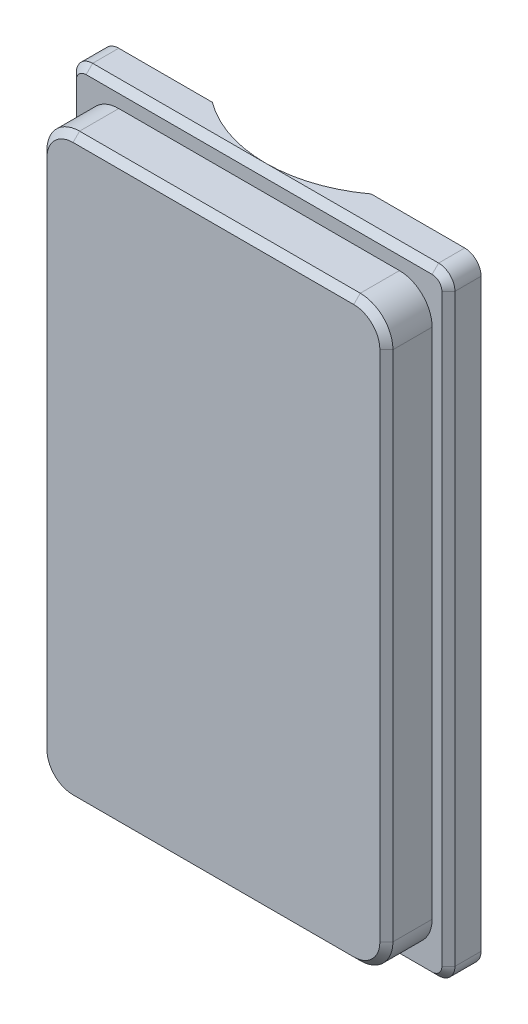
ISO-10303-21;
HEADER;
FILE_DESCRIPTION(('STEP AP214'),'2;1');
FILE_NAME('part.step','',(''),(''),'','','');
FILE_SCHEMA(('AUTOMOTIVE_DESIGN { 1 0 10303 214 1 1 1 1 }'));
ENDSEC;
DATA;
#1=APPLICATION_CONTEXT('core data for automotive mechanical design processes');
#2=APPLICATION_PROTOCOL_DEFINITION('international standard','automotive_design',2000,#1);
#3=PRODUCT_CONTEXT('',#1,'mechanical');
#4=PRODUCT('Part','Part','',(#3));
#5=PRODUCT_RELATED_PRODUCT_CATEGORY('part','',(#4));
#6=PRODUCT_DEFINITION_FORMATION('','',#4);
#7=PRODUCT_DEFINITION_CONTEXT('part definition',#1,'design');
#8=PRODUCT_DEFINITION('design','',#6,#7);
#9=PRODUCT_DEFINITION_SHAPE('','',#8);
#10=(LENGTH_UNIT() NAMED_UNIT(*) SI_UNIT(.MILLI.,.METRE.));
#11=(NAMED_UNIT(*) PLANE_ANGLE_UNIT() SI_UNIT($,.RADIAN.));
#12=(NAMED_UNIT(*) SI_UNIT($,.STERADIAN.) SOLID_ANGLE_UNIT());
#13=UNCERTAINTY_MEASURE_WITH_UNIT(LENGTH_MEASURE(1.E-05),#10,'distance_accuracy_value','');
#14=(GEOMETRIC_REPRESENTATION_CONTEXT(3) GLOBAL_UNCERTAINTY_ASSIGNED_CONTEXT((#13)) GLOBAL_UNIT_ASSIGNED_CONTEXT((#10,
#11,#12)) REPRESENTATION_CONTEXT('',''));
#15=CARTESIAN_POINT('',(0.,0.,0.));
#16=DIRECTION('',(0.,0.,1.));
#17=DIRECTION('',(1.,0.,0.));
#18=AXIS2_PLACEMENT_3D('',#15,#16,#17);
#19=CARTESIAN_POINT('',(5.3,-78.9729999997179,0.));
#20=DIRECTION('',(0.,0.,1.));
#21=DIRECTION('',(1.,0.,0.));
#22=AXIS2_PLACEMENT_3D('',#19,#20,#21);
#23=PLANE('',#22);
#24=DIRECTION('',(-1.,0.,0.));
#25=VECTOR('',#24,1.);
#26=CARTESIAN_POINT('',(5.3,-60.5629999997179,0.));
#27=LINE('',#26,#25);
#28=CARTESIAN_POINT('',(-2.43310501226972,-60.5629999997179,0.));
#29=VERTEX_POINT('',#28);
#30=CARTESIAN_POINT('',(-5.30000000000002,-60.5629999997179,0.));
#31=VERTEX_POINT('',#30);
#32=EDGE_CURVE('E240',#29,#31,#27,.T.);
#33=ORIENTED_EDGE('',*,*,#32,.F.);
#34=DIRECTION('',(0.,-1.,0.));
#35=VECTOR('',#34,1.);
#36=CARTESIAN_POINT('',(-2.43310501226972,-60.5629999997179,0.));
#37=LINE('',#36,#35);
#38=CARTESIAN_POINT('',(-2.43310501226972,-79.4729999997179,0.));
#39=VERTEX_POINT('',#38);
#40=EDGE_CURVE('E234',#29,#39,#37,.T.);
#41=ORIENTED_EDGE('',*,*,#40,.T.);
#42=DIRECTION('',(1.,0.,0.));
#43=VECTOR('',#42,1.);
#44=CARTESIAN_POINT('',(5.3,-79.4729999997179,0.));
#45=LINE('',#44,#43);
#46=CARTESIAN_POINT('',(-5.30000000000002,-79.4729999997179,0.));
#47=VERTEX_POINT('',#46);
#48=EDGE_CURVE('E242',#47,#39,#45,.T.);
#49=ORIENTED_EDGE('',*,*,#48,.F.);
#50=CARTESIAN_POINT('',(-5.30000000000002,-78.9729999997179,0.));
#51=DIRECTION('',(0.,0.,-1.));
#52=DIRECTION('',(-1.,0.,0.));
#53=AXIS2_PLACEMENT_3D('',#50,#51,#52);
#54=CIRCLE('',#53,0.500000000000001);
#55=CARTESIAN_POINT('',(-5.80000000000002,-78.9729999997179,0.));
#56=VERTEX_POINT('',#55);
#57=EDGE_CURVE('E483',#47,#56,#54,.T.);
#58=ORIENTED_EDGE('',*,*,#57,.T.);
#59=DIRECTION('',(0.,1.,0.));
#60=VECTOR('',#59,1.);
#61=CARTESIAN_POINT('',(-5.80000000000001,-61.0629999997179,0.));
#62=LINE('',#61,#60);
#63=CARTESIAN_POINT('',(-5.80000000000001,-61.0629999997179,0.));
#64=VERTEX_POINT('',#63);
#65=EDGE_CURVE('E491',#56,#64,#62,.T.);
#66=ORIENTED_EDGE('',*,*,#65,.T.);
#67=CARTESIAN_POINT('',(-5.30000000000002,-61.0629999997179,0.));
#68=DIRECTION('',(0.,0.,-1.));
#69=DIRECTION('',(-1.,0.,0.));
#70=AXIS2_PLACEMENT_3D('',#67,#68,#69);
#71=CIRCLE('',#70,0.5);
#72=EDGE_CURVE('E485',#64,#31,#71,.T.);
#73=ORIENTED_EDGE('',*,*,#72,.T.);
#74=EDGE_LOOP('',(#33,#41,#49,#58,#66,#73));
#75=FACE_BOUND('',#74,.T.);
#76=ADVANCED_FACE('F37',(#75),#23,.F.);
#77=CARTESIAN_POINT('',(5.3,-60.5629999997179,1.));
#78=DIRECTION('',(0.,-1.,0.));
#79=DIRECTION('',(0.,0.,-1.));
#80=AXIS2_PLACEMENT_3D('',#77,#78,#79);
#81=PLANE('',#80);
#82=CARTESIAN_POINT('',(5.3,-60.5629999997179,0.));
#83=VERTEX_POINT('',#82);
#84=CARTESIAN_POINT('',(2.43310501196556,-60.5629999997179,0.));
#85=VERTEX_POINT('',#84);
#86=EDGE_CURVE('E231',#83,#85,#27,.T.);
#87=ORIENTED_EDGE('',*,*,#86,.T.);
#88=CARTESIAN_POINT('',(-1.52082346450913E-10,-60.5629999997179,-3.29999999999499));
#89=DIRECTION('',(0.,-1.,0.));
#90=DIRECTION('',(0.,0.,-1.));
#91=AXIS2_PLACEMENT_3D('',#88,#89,#90);
#92=CIRCLE('',#91,4.09999999999499);
#93=CARTESIAN_POINT('',(-1.52082346450913E-10,-60.5629999997179,0.800000000000001));
#94=VERTEX_POINT('',#93);
#95=EDGE_CURVE('E216',#85,#94,#92,.T.);
#96=ORIENTED_EDGE('',*,*,#95,.T.);
#97=DIRECTION('',(1.,0.,0.));
#98=VECTOR('',#97,1.);
#99=CARTESIAN_POINT('',(5.3,-60.5629999997179,0.800000000000001));
#100=LINE('',#99,#98);
#101=CARTESIAN_POINT('',(5.3,-60.5629999997179,0.800000000000001));
#102=VERTEX_POINT('',#101);
#103=EDGE_CURVE('E298',#94,#102,#100,.T.);
#104=ORIENTED_EDGE('',*,*,#103,.T.);
#105=DIRECTION('',(0.,0.,-1.));
#106=VECTOR('',#105,1.);
#107=CARTESIAN_POINT('',(5.3,-60.5629999997179,1.));
#108=LINE('',#107,#106);
#109=EDGE_CURVE('E238',#102,#83,#108,.T.);
#110=ORIENTED_EDGE('',*,*,#109,.T.);
#111=EDGE_LOOP('',(#87,#96,#104,#110));
#112=FACE_BOUND('',#111,.T.);
#113=ADVANCED_FACE('F236',(#112),#81,.F.);
#114=CARTESIAN_POINT('',(5.3,-79.4729999997179,1.));
#115=DIRECTION('',(0.,1.,0.));
#116=DIRECTION('',(0.,0.,1.));
#117=AXIS2_PLACEMENT_3D('',#114,#115,#116);
#118=PLANE('',#117);
#119=DIRECTION('',(-1.,0.,0.));
#120=VECTOR('',#119,1.);
#121=CARTESIAN_POINT('',(-5.30000000000002,-79.4729999997179,0.800000000000001));
#122=LINE('',#121,#120);
#123=CARTESIAN_POINT('',(5.3,-79.4729999997179,0.800000000000001));
#124=VERTEX_POINT('',#123);
#125=CARTESIAN_POINT('',(-1.52082339777149E-10,-79.4729999997179,0.800000000000001));
#126=VERTEX_POINT('',#125);
#127=EDGE_CURVE('E295',#124,#126,#122,.T.);
#128=ORIENTED_EDGE('',*,*,#127,.T.);
#129=CARTESIAN_POINT('',(-1.52082346450913E-10,-79.4729999997179,-3.29999999999499));
#130=DIRECTION('',(0.,-1.,0.));
#131=DIRECTION('',(0.,0.,-1.));
#132=AXIS2_PLACEMENT_3D('',#129,#130,#131);
#133=CIRCLE('',#132,4.09999999999499);
#134=CARTESIAN_POINT('',(2.43310501196556,-79.4729999997179,0.));
#135=VERTEX_POINT('',#134);
#136=EDGE_CURVE('E54',#135,#126,#133,.T.);
#137=ORIENTED_EDGE('',*,*,#136,.F.);
#138=CARTESIAN_POINT('',(5.3,-79.4729999997179,0.));
#139=VERTEX_POINT('',#138);
#140=EDGE_CURVE('E233',#135,#139,#45,.T.);
#141=ORIENTED_EDGE('',*,*,#140,.T.);
#142=DIRECTION('',(0.,0.,-1.));
#143=VECTOR('',#142,1.);
#144=CARTESIAN_POINT('',(5.3,-79.4729999997179,1.));
#145=LINE('',#144,#143);
#146=EDGE_CURVE('E249',#124,#139,#145,.T.);
#147=ORIENTED_EDGE('',*,*,#146,.F.);
#148=EDGE_LOOP('',(#128,#137,#141,#147));
#149=FACE_BOUND('',#148,.T.);
#150=ADVANCED_FACE('F461',(#149),#118,.F.);
#151=ORIENTED_EDGE('',*,*,#140,.F.);
#152=DIRECTION('',(0.,-1.,0.));
#153=VECTOR('',#152,1.);
#154=CARTESIAN_POINT('',(2.43310501196556,-60.5629999997179,0.));
#155=LINE('',#154,#153);
#156=EDGE_CURVE('E219',#135,#85,#155,.F.);
#157=ORIENTED_EDGE('',*,*,#156,.T.);
#158=ORIENTED_EDGE('',*,*,#86,.F.);
#159=CARTESIAN_POINT('',(5.3,-61.0629999997179,0.));
#160=DIRECTION('',(0.,0.,1.));
#161=DIRECTION('',(1.,0.,0.));
#162=AXIS2_PLACEMENT_3D('',#159,#160,#161);
#163=CIRCLE('',#162,0.5);
#164=CARTESIAN_POINT('',(5.8,-61.0629999997179,0.));
#165=VERTEX_POINT('',#164);
#166=EDGE_CURVE('E244',#165,#83,#163,.T.);
#167=ORIENTED_EDGE('',*,*,#166,.F.);
#168=DIRECTION('',(0.,1.,0.));
#169=VECTOR('',#168,1.);
#170=CARTESIAN_POINT('',(5.8,-61.0629999997179,0.));
#171=LINE('',#170,#169);
#172=CARTESIAN_POINT('',(5.8,-78.9729999997179,0.));
#173=VERTEX_POINT('',#172);
#174=EDGE_CURVE('E445',#173,#165,#171,.T.);
#175=ORIENTED_EDGE('',*,*,#174,.F.);
#176=CARTESIAN_POINT('',(5.3,-78.9729999997179,0.));
#177=DIRECTION('',(0.,0.,1.));
#178=DIRECTION('',(1.,0.,0.));
#179=AXIS2_PLACEMENT_3D('',#176,#177,#178);
#180=CIRCLE('',#179,0.500000000000001);
#181=EDGE_CURVE('E443',#139,#173,#180,.T.);
#182=ORIENTED_EDGE('',*,*,#181,.F.);
#183=EDGE_LOOP('',(#151,#157,#158,#167,#175,#182));
#184=FACE_BOUND('',#183,.T.);
#185=ADVANCED_FACE('F229',(#184),#23,.F.);
#186=CARTESIAN_POINT('',(5.3,-78.9729999997179,1.));
#187=DIRECTION('',(0.,0.,-1.));
#188=DIRECTION('',(-1.,0.,0.));
#189=AXIS2_PLACEMENT_3D('',#186,#187,#188);
#190=CYLINDRICAL_SURFACE('',#189,0.500000000000001);
#191=DIRECTION('',(0.,0.,-1.));
#192=VECTOR('',#191,1.);
#193=CARTESIAN_POINT('',(5.8,-78.9729999997179,1.));
#194=LINE('',#193,#192);
#195=CARTESIAN_POINT('',(5.8,-78.9729999997179,0.800000000000001));
#196=VERTEX_POINT('',#195);
#197=EDGE_CURVE('E255',#196,#173,#194,.T.);
#198=ORIENTED_EDGE('',*,*,#197,.F.);
#199=CARTESIAN_POINT('',(5.3,-78.9729999997179,0.800000000000001));
#200=DIRECTION('',(0.,0.,1.));
#201=DIRECTION('',(1.,0.,0.));
#202=AXIS2_PLACEMENT_3D('',#199,#200,#201);
#203=CIRCLE('',#202,0.500000000000001);
#204=EDGE_CURVE('E302',#196,#124,#203,.F.);
#205=ORIENTED_EDGE('',*,*,#204,.T.);
#206=ORIENTED_EDGE('',*,*,#146,.T.);
#207=ORIENTED_EDGE('',*,*,#181,.T.);
#208=EDGE_LOOP('',(#198,#205,#206,#207));
#209=FACE_BOUND('',#208,.T.);
#210=ADVANCED_FACE('F455',(#209),#190,.T.);
#211=CARTESIAN_POINT('',(5.8,-61.0629999997179,1.));
#212=DIRECTION('',(-1.,0.,0.));
#213=DIRECTION('',(0.,-1.,0.));
#214=AXIS2_PLACEMENT_3D('',#211,#212,#213);
#215=PLANE('',#214);
#216=DIRECTION('',(0.,0.,-1.));
#217=VECTOR('',#216,1.);
#218=CARTESIAN_POINT('',(5.8,-61.0629999997179,1.));
#219=LINE('',#218,#217);
#220=CARTESIAN_POINT('',(5.8,-61.0629999997179,0.800000000000001));
#221=VERTEX_POINT('',#220);
#222=EDGE_CURVE('E253',#221,#165,#219,.T.);
#223=ORIENTED_EDGE('',*,*,#222,.F.);
#224=DIRECTION('',(0.,-1.,0.));
#225=VECTOR('',#224,1.);
#226=CARTESIAN_POINT('',(5.8,-78.9729999997179,0.800000000000001));
#227=LINE('',#226,#225);
#228=EDGE_CURVE('E306',#221,#196,#227,.T.);
#229=ORIENTED_EDGE('',*,*,#228,.T.);
#230=ORIENTED_EDGE('',*,*,#197,.T.);
#231=ORIENTED_EDGE('',*,*,#174,.T.);
#232=EDGE_LOOP('',(#223,#229,#230,#231));
#233=FACE_BOUND('',#232,.T.);
#234=ADVANCED_FACE('F538',(#233),#215,.F.);
#235=CARTESIAN_POINT('',(5.3,-61.0629999997179,1.));
#236=DIRECTION('',(0.,0.,-1.));
#237=DIRECTION('',(-1.,0.,0.));
#238=AXIS2_PLACEMENT_3D('',#235,#236,#237);
#239=CYLINDRICAL_SURFACE('',#238,0.5);
#240=ORIENTED_EDGE('',*,*,#109,.F.);
#241=CARTESIAN_POINT('',(5.3,-61.0629999997179,0.800000000000001));
#242=DIRECTION('',(0.,0.,1.));
#243=DIRECTION('',(1.,0.,0.));
#244=AXIS2_PLACEMENT_3D('',#241,#242,#243);
#245=CIRCLE('',#244,0.5);
#246=EDGE_CURVE('E304',#102,#221,#245,.F.);
#247=ORIENTED_EDGE('',*,*,#246,.T.);
#248=ORIENTED_EDGE('',*,*,#222,.T.);
#249=ORIENTED_EDGE('',*,*,#166,.T.);
#250=EDGE_LOOP('',(#240,#247,#248,#249));
#251=FACE_BOUND('',#250,.T.);
#252=ADVANCED_FACE('F451',(#251),#239,.T.);
#253=CARTESIAN_POINT('',(-5.30000000000002,-60.5629999997179,0.800000000000001));
#254=VERTEX_POINT('',#253);
#255=EDGE_CURVE('E299',#254,#94,#100,.T.);
#256=ORIENTED_EDGE('',*,*,#255,.T.);
#257=EDGE_CURVE('E221',#94,#29,#92,.T.);
#258=ORIENTED_EDGE('',*,*,#257,.T.);
#259=ORIENTED_EDGE('',*,*,#32,.T.);
#260=DIRECTION('',(0.,0.,-1.));
#261=VECTOR('',#260,1.);
#262=CARTESIAN_POINT('',(-5.30000000000002,-60.5629999997179,1.));
#263=LINE('',#262,#261);
#264=EDGE_CURVE('E484',#254,#31,#263,.T.);
#265=ORIENTED_EDGE('',*,*,#264,.F.);
#266=EDGE_LOOP('',(#256,#258,#259,#265));
#267=FACE_BOUND('',#266,.T.);
#268=ADVANCED_FACE('F511',(#267),#81,.F.);
#269=ORIENTED_EDGE('',*,*,#48,.T.);
#270=EDGE_CURVE('E477',#126,#39,#133,.T.);
#271=ORIENTED_EDGE('',*,*,#270,.F.);
#272=CARTESIAN_POINT('',(-5.30000000000002,-79.4729999997179,0.800000000000001));
#273=VERTEX_POINT('',#272);
#274=EDGE_CURVE('E294',#126,#273,#122,.T.);
#275=ORIENTED_EDGE('',*,*,#274,.T.);
#276=DIRECTION('',(0.,0.,-1.));
#277=VECTOR('',#276,1.);
#278=CARTESIAN_POINT('',(-5.30000000000002,-79.4729999997179,1.));
#279=LINE('',#278,#277);
#280=EDGE_CURVE('E475',#273,#47,#279,.T.);
#281=ORIENTED_EDGE('',*,*,#280,.T.);
#282=EDGE_LOOP('',(#269,#271,#275,#281));
#283=FACE_BOUND('',#282,.T.);
#284=ADVANCED_FACE('F474',(#283),#118,.F.);
#285=CARTESIAN_POINT('',(5.3,-78.9729999997179,1.));
#286=DIRECTION('',(0.,0.,1.));
#287=DIRECTION('',(1.,0.,0.));
#288=AXIS2_PLACEMENT_3D('',#285,#286,#287);
#289=PLANE('',#288);
#290=CARTESIAN_POINT('',(-5.30000000000002,-61.0629999997179,1.));
#291=DIRECTION('',(0.,0.,1.));
#292=DIRECTION('',(1.,0.,0.));
#293=AXIS2_PLACEMENT_3D('',#290,#291,#292);
#294=CIRCLE('',#293,0.300000000000002);
#295=CARTESIAN_POINT('',(-5.30000000000002,-60.7629999997179,1.));
#296=VERTEX_POINT('',#295);
#297=CARTESIAN_POINT('',(-5.60000000000002,-61.0629999997179,1.));
#298=VERTEX_POINT('',#297);
#299=EDGE_CURVE('E283',#296,#298,#294,.T.);
#300=ORIENTED_EDGE('',*,*,#299,.T.);
#301=DIRECTION('',(0.,-1.,0.));
#302=VECTOR('',#301,1.);
#303=CARTESIAN_POINT('',(-5.60000000000002,-78.9729999997179,1.));
#304=LINE('',#303,#302);
#305=CARTESIAN_POINT('',(-5.60000000000003,-78.9729999997179,1.));
#306=VERTEX_POINT('',#305);
#307=EDGE_CURVE('E287',#298,#306,#304,.T.);
#308=ORIENTED_EDGE('',*,*,#307,.T.);
#309=CARTESIAN_POINT('',(-5.30000000000002,-78.9729999997179,1.));
#310=DIRECTION('',(0.,0.,1.));
#311=DIRECTION('',(1.,0.,0.));
#312=AXIS2_PLACEMENT_3D('',#309,#310,#311);
#313=CIRCLE('',#312,0.300000000000009);
#314=CARTESIAN_POINT('',(-5.30000000000002,-79.2729999997179,1.));
#315=VERTEX_POINT('',#314);
#316=EDGE_CURVE('E285',#306,#315,#313,.T.);
#317=ORIENTED_EDGE('',*,*,#316,.T.);
#318=DIRECTION('',(1.,0.,0.));
#319=VECTOR('',#318,1.);
#320=CARTESIAN_POINT('',(5.3,-79.2729999997179,1.));
#321=LINE('',#320,#319);
#322=CARTESIAN_POINT('',(5.3,-79.2729999997179,1.));
#323=VERTEX_POINT('',#322);
#324=EDGE_CURVE('E281',#315,#323,#321,.T.);
#325=ORIENTED_EDGE('',*,*,#324,.T.);
#326=CARTESIAN_POINT('',(5.3,-78.9729999997179,1.));
#327=DIRECTION('',(0.,0.,1.));
#328=DIRECTION('',(1.,0.,0.));
#329=AXIS2_PLACEMENT_3D('',#326,#327,#328);
#330=CIRCLE('',#329,0.300000000000003);
#331=CARTESIAN_POINT('',(5.6,-78.9729999997179,1.));
#332=VERTEX_POINT('',#331);
#333=EDGE_CURVE('E277',#323,#332,#330,.T.);
#334=ORIENTED_EDGE('',*,*,#333,.T.);
#335=DIRECTION('',(0.,1.,0.));
#336=VECTOR('',#335,1.);
#337=CARTESIAN_POINT('',(5.6,-61.0629999997179,1.));
#338=LINE('',#337,#336);
#339=CARTESIAN_POINT('',(5.6,-61.0629999997179,1.));
#340=VERTEX_POINT('',#339);
#341=EDGE_CURVE('E273',#332,#340,#338,.T.);
#342=ORIENTED_EDGE('',*,*,#341,.T.);
#343=CARTESIAN_POINT('',(5.3,-61.0629999997179,1.));
#344=DIRECTION('',(0.,0.,1.));
#345=DIRECTION('',(1.,0.,0.));
#346=AXIS2_PLACEMENT_3D('',#343,#344,#345);
#347=CIRCLE('',#346,0.300000000000002);
#348=CARTESIAN_POINT('',(5.3,-60.7629999997179,1.));
#349=VERTEX_POINT('',#348);
#350=EDGE_CURVE('E275',#340,#349,#347,.T.);
#351=ORIENTED_EDGE('',*,*,#350,.T.);
#352=DIRECTION('',(-1.,0.,0.));
#353=VECTOR('',#352,1.);
#354=CARTESIAN_POINT('',(-5.30000000000002,-60.7629999997179,1.));
#355=LINE('',#354,#353);
#356=EDGE_CURVE('E279',#349,#296,#355,.T.);
#357=ORIENTED_EDGE('',*,*,#356,.T.);
#358=EDGE_LOOP('',(#300,#308,#317,#325,#334,#342,#351,#357));
#359=FACE_BOUND('',#358,.T.);
#360=DIRECTION('',(-1.,0.,0.));
#361=VECTOR('',#360,1.);
#362=CARTESIAN_POINT('',(0.,-61.1629999997179,1.));
#363=LINE('',#362,#361);
#364=CARTESIAN_POINT('',(4.3,-61.1629999997179,1.));
#365=VERTEX_POINT('',#364);
#366=CARTESIAN_POINT('',(-4.30000000000002,-61.1629999997179,1.));
#367=VERTEX_POINT('',#366);
#368=EDGE_CURVE('E434',#365,#367,#363,.T.);
#369=ORIENTED_EDGE('',*,*,#368,.F.);
#370=CARTESIAN_POINT('',(4.3,-62.1629999997179,1.));
#371=DIRECTION('',(0.,0.,1.));
#372=DIRECTION('',(1.,0.,0.));
#373=AXIS2_PLACEMENT_3D('',#370,#371,#372);
#374=CIRCLE('',#373,1.);
#375=CARTESIAN_POINT('',(5.3,-62.1629999997179,1.));
#376=VERTEX_POINT('',#375);
#377=EDGE_CURVE('E266',#365,#376,#374,.F.);
#378=ORIENTED_EDGE('',*,*,#377,.T.);
#379=DIRECTION('',(0.,1.,0.));
#380=VECTOR('',#379,1.);
#381=CARTESIAN_POINT('',(5.3,-61.1629999997179,1.));
#382=LINE('',#381,#380);
#383=CARTESIAN_POINT('',(5.3,-77.8729999997179,1.));
#384=VERTEX_POINT('',#383);
#385=EDGE_CURVE('E440',#384,#376,#382,.T.);
#386=ORIENTED_EDGE('',*,*,#385,.F.);
#387=CARTESIAN_POINT('',(4.3,-77.8729999997179,1.));
#388=DIRECTION('',(0.,0.,1.));
#389=DIRECTION('',(1.,0.,0.));
#390=AXIS2_PLACEMENT_3D('',#387,#388,#389);
#391=CIRCLE('',#390,1.);
#392=CARTESIAN_POINT('',(4.3,-78.8729999997179,1.));
#393=VERTEX_POINT('',#392);
#394=EDGE_CURVE('E268',#384,#393,#391,.F.);
#395=ORIENTED_EDGE('',*,*,#394,.T.);
#396=DIRECTION('',(1.,0.,0.));
#397=VECTOR('',#396,1.);
#398=CARTESIAN_POINT('',(5.3,-78.8729999997179,1.));
#399=LINE('',#398,#397);
#400=CARTESIAN_POINT('',(-4.30000000000002,-78.8729999997179,1.));
#401=VERTEX_POINT('',#400);
#402=EDGE_CURVE('E437',#401,#393,#399,.T.);
#403=ORIENTED_EDGE('',*,*,#402,.F.);
#404=CARTESIAN_POINT('',(-4.30000000000002,-77.8729999997179,1.));
#405=DIRECTION('',(0.,0.,-1.));
#406=DIRECTION('',(-1.,0.,0.));
#407=AXIS2_PLACEMENT_3D('',#404,#405,#406);
#408=CIRCLE('',#407,1.);
#409=CARTESIAN_POINT('',(-5.30000000000002,-77.8729999997179,1.));
#410=VERTEX_POINT('',#409);
#411=EDGE_CURVE('E432',#410,#401,#408,.F.);
#412=ORIENTED_EDGE('',*,*,#411,.F.);
#413=DIRECTION('',(0.,1.,0.));
#414=VECTOR('',#413,1.);
#415=CARTESIAN_POINT('',(-5.30000000000002,-61.1629999997179,1.));
#416=LINE('',#415,#414);
#417=CARTESIAN_POINT('',(-5.30000000000002,-62.1629999997179,1.));
#418=VERTEX_POINT('',#417);
#419=EDGE_CURVE('E361',#410,#418,#416,.T.);
#420=ORIENTED_EDGE('',*,*,#419,.T.);
#421=CARTESIAN_POINT('',(-4.30000000000002,-62.1629999997179,1.));
#422=DIRECTION('',(0.,0.,-1.));
#423=DIRECTION('',(-1.,0.,0.));
#424=AXIS2_PLACEMENT_3D('',#421,#422,#423);
#425=CIRCLE('',#424,1.);
#426=EDGE_CURVE('E429',#367,#418,#425,.F.);
#427=ORIENTED_EDGE('',*,*,#426,.F.);
#428=EDGE_LOOP('',(#369,#378,#386,#395,#403,#412,#420,#427));
#429=FACE_BOUND('',#428,.T.);
#430=ADVANCED_FACE('F527',(#359,#429),#289,.T.);
#431=CARTESIAN_POINT('',(0.,-61.1629999997179,2.4));
#432=DIRECTION('',(0.,-1.,0.));
#433=DIRECTION('',(0.,0.,-1.));
#434=AXIS2_PLACEMENT_3D('',#431,#432,#433);
#435=PLANE('',#434);
#436=DIRECTION('',(0.,0.,-1.));
#437=VECTOR('',#436,1.);
#438=CARTESIAN_POINT('',(-4.30000000000002,-61.1629999997179,2.4));
#439=LINE('',#438,#437);
#440=CARTESIAN_POINT('',(-4.30000000000002,-61.1629999997179,2.2));
#441=VERTEX_POINT('',#440);
#442=EDGE_CURVE('E421',#441,#367,#439,.T.);
#443=ORIENTED_EDGE('',*,*,#442,.F.);
#444=DIRECTION('',(1.,0.,0.));
#445=VECTOR('',#444,1.);
#446=CARTESIAN_POINT('',(0.,-61.1629999997179,2.2));
#447=LINE('',#446,#445);
#448=CARTESIAN_POINT('',(4.3,-61.1629999997179,2.2));
#449=VERTEX_POINT('',#448);
#450=EDGE_CURVE('E334',#441,#449,#447,.T.);
#451=ORIENTED_EDGE('',*,*,#450,.T.);
#452=DIRECTION('',(0.,0.,-1.));
#453=VECTOR('',#452,1.);
#454=CARTESIAN_POINT('',(4.3,-61.1629999997179,2.4));
#455=LINE('',#454,#453);
#456=EDGE_CURVE('E257',#449,#365,#455,.T.);
#457=ORIENTED_EDGE('',*,*,#456,.T.);
#458=ORIENTED_EDGE('',*,*,#368,.T.);
#459=EDGE_LOOP('',(#443,#451,#457,#458));
#460=FACE_BOUND('',#459,.T.);
#461=ADVANCED_FACE('F576',(#460),#435,.F.);
#462=CARTESIAN_POINT('',(5.3,-78.8729999997179,2.4));
#463=DIRECTION('',(0.,1.,0.));
#464=DIRECTION('',(0.,0.,1.));
#465=AXIS2_PLACEMENT_3D('',#462,#463,#464);
#466=PLANE('',#465);
#467=DIRECTION('',(0.,0.,-1.));
#468=VECTOR('',#467,1.);
#469=CARTESIAN_POINT('',(4.3,-78.8729999997179,2.4));
#470=LINE('',#469,#468);
#471=CARTESIAN_POINT('',(4.3,-78.8729999997179,2.2));
#472=VERTEX_POINT('',#471);
#473=EDGE_CURVE('E263',#393,#472,#470,.F.);
#474=ORIENTED_EDGE('',*,*,#473,.T.);
#475=DIRECTION('',(-1.,0.,0.));
#476=VECTOR('',#475,1.);
#477=CARTESIAN_POINT('',(5.3,-78.8729999997179,2.2));
#478=LINE('',#477,#476);
#479=CARTESIAN_POINT('',(-4.30000000000002,-78.8729999997179,2.2));
#480=VERTEX_POINT('',#479);
#481=EDGE_CURVE('E332',#472,#480,#478,.T.);
#482=ORIENTED_EDGE('',*,*,#481,.T.);
#483=DIRECTION('',(0.,0.,-1.));
#484=VECTOR('',#483,1.);
#485=CARTESIAN_POINT('',(-4.30000000000002,-78.8729999997179,2.4));
#486=LINE('',#485,#484);
#487=EDGE_CURVE('E414',#401,#480,#486,.F.);
#488=ORIENTED_EDGE('',*,*,#487,.F.);
#489=ORIENTED_EDGE('',*,*,#402,.T.);
#490=EDGE_LOOP('',(#474,#482,#488,#489));
#491=FACE_BOUND('',#490,.T.);
#492=ADVANCED_FACE('F808',(#491),#466,.F.);
#493=CARTESIAN_POINT('',(5.3,-61.1629999997179,2.4));
#494=DIRECTION('',(-1.,0.,0.));
#495=DIRECTION('',(0.,0.,1.));
#496=AXIS2_PLACEMENT_3D('',#493,#494,#495);
#497=PLANE('',#496);
#498=DIRECTION('',(0.,0.,-1.));
#499=VECTOR('',#498,1.);
#500=CARTESIAN_POINT('',(5.3,-62.1629999997179,2.4));
#501=LINE('',#500,#499);
#502=CARTESIAN_POINT('',(5.3,-62.1629999997179,2.2));
#503=VERTEX_POINT('',#502);
#504=EDGE_CURVE('E261',#376,#503,#501,.F.);
#505=ORIENTED_EDGE('',*,*,#504,.T.);
#506=DIRECTION('',(0.,-1.,0.));
#507=VECTOR('',#506,1.);
#508=CARTESIAN_POINT('',(5.3,-61.1629999997179,2.2));
#509=LINE('',#508,#507);
#510=CARTESIAN_POINT('',(5.3,-77.8729999997179,2.2));
#511=VERTEX_POINT('',#510);
#512=EDGE_CURVE('E11',#503,#511,#509,.T.);
#513=ORIENTED_EDGE('',*,*,#512,.T.);
#514=DIRECTION('',(0.,0.,-1.));
#515=VECTOR('',#514,1.);
#516=CARTESIAN_POINT('',(5.3,-77.8729999997179,2.4));
#517=LINE('',#516,#515);
#518=EDGE_CURVE('E259',#511,#384,#517,.T.);
#519=ORIENTED_EDGE('',*,*,#518,.T.);
#520=ORIENTED_EDGE('',*,*,#385,.T.);
#521=EDGE_LOOP('',(#505,#513,#519,#520));
#522=FACE_BOUND('',#521,.T.);
#523=ADVANCED_FACE('F798',(#522),#497,.F.);
#524=CARTESIAN_POINT('',(0.,0.,2.4));
#525=DIRECTION('',(0.,0.,-1.));
#526=DIRECTION('',(-1.,0.,0.));
#527=AXIS2_PLACEMENT_3D('',#524,#525,#526);
#528=PLANE('',#527);
#529=CARTESIAN_POINT('',(-4.30000000000002,-62.1629999997179,2.4));
#530=DIRECTION('',(0.,0.,-1.));
#531=DIRECTION('',(-1.,0.,0.));
#532=AXIS2_PLACEMENT_3D('',#529,#530,#531);
#533=CIRCLE('',#532,0.800000000000002);
#534=CARTESIAN_POINT('',(-4.30000000000002,-61.3629999997179,2.4));
#535=VERTEX_POINT('',#534);
#536=CARTESIAN_POINT('',(-5.10000000000002,-62.1629999997179,2.4));
#537=VERTEX_POINT('',#536);
#538=EDGE_CURVE('E321',#535,#537,#533,.F.);
#539=ORIENTED_EDGE('',*,*,#538,.T.);
#540=DIRECTION('',(0.,-1.,0.));
#541=VECTOR('',#540,1.);
#542=CARTESIAN_POINT('',(-5.1,0.,2.4));
#543=LINE('',#542,#541);
#544=CARTESIAN_POINT('',(-5.10000000000001,-77.8729999997179,2.4));
#545=VERTEX_POINT('',#544);
#546=EDGE_CURVE('E325',#537,#545,#543,.T.);
#547=ORIENTED_EDGE('',*,*,#546,.T.);
#548=CARTESIAN_POINT('',(-4.30000000000002,-77.8729999997179,2.4));
#549=DIRECTION('',(0.,0.,-1.));
#550=DIRECTION('',(-1.,0.,0.));
#551=AXIS2_PLACEMENT_3D('',#548,#549,#550);
#552=CIRCLE('',#551,0.799999999999995);
#553=CARTESIAN_POINT('',(-4.30000000000002,-78.6729999997179,2.4));
#554=VERTEX_POINT('',#553);
#555=EDGE_CURVE('E323',#545,#554,#552,.F.);
#556=ORIENTED_EDGE('',*,*,#555,.T.);
#557=DIRECTION('',(1.,0.,0.));
#558=VECTOR('',#557,1.);
#559=CARTESIAN_POINT('',(0.,-78.6729999997179,2.4));
#560=LINE('',#559,#558);
#561=CARTESIAN_POINT('',(4.3,-78.6729999997179,2.4));
#562=VERTEX_POINT('',#561);
#563=EDGE_CURVE('E319',#554,#562,#560,.T.);
#564=ORIENTED_EDGE('',*,*,#563,.T.);
#565=CARTESIAN_POINT('',(4.3,-77.8729999997179,2.4));
#566=DIRECTION('',(0.,0.,-1.));
#567=DIRECTION('',(-1.,0.,0.));
#568=AXIS2_PLACEMENT_3D('',#565,#566,#567);
#569=CIRCLE('',#568,0.800000000000001);
#570=CARTESIAN_POINT('',(5.1,-77.8729999997179,2.4));
#571=VERTEX_POINT('',#570);
#572=EDGE_CURVE('E315',#562,#571,#569,.F.);
#573=ORIENTED_EDGE('',*,*,#572,.T.);
#574=DIRECTION('',(0.,1.,0.));
#575=VECTOR('',#574,1.);
#576=CARTESIAN_POINT('',(5.1,0.,2.4));
#577=LINE('',#576,#575);
#578=CARTESIAN_POINT('',(5.1,-62.1629999997179,2.4));
#579=VERTEX_POINT('',#578);
#580=EDGE_CURVE('E311',#571,#579,#577,.T.);
#581=ORIENTED_EDGE('',*,*,#580,.T.);
#582=CARTESIAN_POINT('',(4.3,-62.1629999997179,2.4));
#583=DIRECTION('',(0.,0.,-1.));
#584=DIRECTION('',(-1.,0.,0.));
#585=AXIS2_PLACEMENT_3D('',#582,#583,#584);
#586=CIRCLE('',#585,0.800000000000002);
#587=CARTESIAN_POINT('',(4.3,-61.3629999997179,2.4));
#588=VERTEX_POINT('',#587);
#589=EDGE_CURVE('E313',#579,#588,#586,.F.);
#590=ORIENTED_EDGE('',*,*,#589,.T.);
#591=DIRECTION('',(-1.,0.,0.));
#592=VECTOR('',#591,1.);
#593=CARTESIAN_POINT('',(0.,-61.3629999997179,2.4));
#594=LINE('',#593,#592);
#595=EDGE_CURVE('E317',#588,#535,#594,.T.);
#596=ORIENTED_EDGE('',*,*,#595,.T.);
#597=EDGE_LOOP('',(#539,#547,#556,#564,#573,#581,#590,#596));
#598=FACE_BOUND('',#597,.T.);
#599=ADVANCED_FACE('F393',(#598),#528,.F.);
#600=CARTESIAN_POINT('',(4.3,-62.1629999997179,2.4));
#601=DIRECTION('',(0.,0.,-1.));
#602=DIRECTION('',(-1.,0.,0.));
#603=AXIS2_PLACEMENT_3D('',#600,#601,#602);
#604=CYLINDRICAL_SURFACE('',#603,1.);
#605=ORIENTED_EDGE('',*,*,#456,.F.);
#606=CARTESIAN_POINT('',(4.3,-62.1629999997179,2.2));
#607=DIRECTION('',(0.,0.,-1.));
#608=DIRECTION('',(-1.,0.,0.));
#609=AXIS2_PLACEMENT_3D('',#606,#607,#608);
#610=CIRCLE('',#609,1.);
#611=EDGE_CURVE('E46',#449,#503,#610,.T.);
#612=ORIENTED_EDGE('',*,*,#611,.T.);
#613=ORIENTED_EDGE('',*,*,#504,.F.);
#614=ORIENTED_EDGE('',*,*,#377,.F.);
#615=EDGE_LOOP('',(#605,#612,#613,#614));
#616=FACE_BOUND('',#615,.T.);
#617=ADVANCED_FACE('F584',(#616),#604,.T.);
#618=CARTESIAN_POINT('',(4.3,-77.8729999997179,2.4));
#619=DIRECTION('',(0.,0.,-1.));
#620=DIRECTION('',(-1.,0.,0.));
#621=AXIS2_PLACEMENT_3D('',#618,#619,#620);
#622=CYLINDRICAL_SURFACE('',#621,1.);
#623=ORIENTED_EDGE('',*,*,#518,.F.);
#624=CARTESIAN_POINT('',(4.3,-77.8729999997179,2.2));
#625=DIRECTION('',(0.,0.,-1.));
#626=DIRECTION('',(-1.,0.,0.));
#627=AXIS2_PLACEMENT_3D('',#624,#625,#626);
#628=CIRCLE('',#627,1.);
#629=EDGE_CURVE('E336',#511,#472,#628,.T.);
#630=ORIENTED_EDGE('',*,*,#629,.T.);
#631=ORIENTED_EDGE('',*,*,#473,.F.);
#632=ORIENTED_EDGE('',*,*,#394,.F.);
#633=EDGE_LOOP('',(#623,#630,#631,#632));
#634=FACE_BOUND('',#633,.T.);
#635=ADVANCED_FACE('F587',(#634),#622,.T.);
#636=CARTESIAN_POINT('',(-5.30000000000002,-78.9729999997179,1.));
#637=DIRECTION('',(0.,0.,-1.));
#638=DIRECTION('',(1.,0.,0.));
#639=AXIS2_PLACEMENT_3D('',#636,#637,#638);
#640=CYLINDRICAL_SURFACE('',#639,0.500000000000001);
#641=ORIENTED_EDGE('',*,*,#280,.F.);
#642=CARTESIAN_POINT('',(-5.30000000000002,-78.9729999997179,0.800000000000001));
#643=DIRECTION('',(0.,0.,1.));
#644=DIRECTION('',(1.,0.,0.));
#645=AXIS2_PLACEMENT_3D('',#642,#643,#644);
#646=CIRCLE('',#645,0.500000000000001);
#647=CARTESIAN_POINT('',(-5.80000000000002,-78.9729999997179,0.800000000000001));
#648=VERTEX_POINT('',#647);
#649=EDGE_CURVE('E290',#273,#648,#646,.F.);
#650=ORIENTED_EDGE('',*,*,#649,.T.);
#651=DIRECTION('',(0.,0.,-1.));
#652=VECTOR('',#651,1.);
#653=CARTESIAN_POINT('',(-5.80000000000002,-78.9729999997179,1.));
#654=LINE('',#653,#652);
#655=EDGE_CURVE('E424',#648,#56,#654,.T.);
#656=ORIENTED_EDGE('',*,*,#655,.T.);
#657=ORIENTED_EDGE('',*,*,#57,.F.);
#658=EDGE_LOOP('',(#641,#650,#656,#657));
#659=FACE_BOUND('',#658,.T.);
#660=ADVANCED_FACE('F480',(#659),#640,.T.);
#661=CARTESIAN_POINT('',(-5.80000000000001,-61.0629999997179,1.));
#662=DIRECTION('',(1.,0.,0.));
#663=DIRECTION('',(0.,-1.,0.));
#664=AXIS2_PLACEMENT_3D('',#661,#662,#663);
#665=PLANE('',#664);
#666=ORIENTED_EDGE('',*,*,#655,.F.);
#667=DIRECTION('',(0.,1.,0.));
#668=VECTOR('',#667,1.);
#669=CARTESIAN_POINT('',(-5.80000000000001,-61.0629999997179,0.800000000000001));
#670=LINE('',#669,#668);
#671=CARTESIAN_POINT('',(-5.80000000000001,-61.0629999997179,0.800000000000001));
#672=VERTEX_POINT('',#671);
#673=EDGE_CURVE('E270',#648,#672,#670,.T.);
#674=ORIENTED_EDGE('',*,*,#673,.T.);
#675=DIRECTION('',(0.,0.,-1.));
#676=VECTOR('',#675,1.);
#677=CARTESIAN_POINT('',(-5.80000000000001,-61.0629999997179,1.));
#678=LINE('',#677,#676);
#679=EDGE_CURVE('E488',#672,#64,#678,.T.);
#680=ORIENTED_EDGE('',*,*,#679,.T.);
#681=ORIENTED_EDGE('',*,*,#65,.F.);
#682=EDGE_LOOP('',(#666,#674,#680,#681));
#683=FACE_BOUND('',#682,.T.);
#684=ADVANCED_FACE('F499',(#683),#665,.F.);
#685=CARTESIAN_POINT('',(-5.30000000000002,-61.0629999997179,1.));
#686=DIRECTION('',(0.,0.,-1.));
#687=DIRECTION('',(1.,0.,0.));
#688=AXIS2_PLACEMENT_3D('',#685,#686,#687);
#689=CYLINDRICAL_SURFACE('',#688,0.5);
#690=ORIENTED_EDGE('',*,*,#679,.F.);
#691=CARTESIAN_POINT('',(-5.30000000000002,-61.0629999997179,0.800000000000001));
#692=DIRECTION('',(0.,0.,1.));
#693=DIRECTION('',(1.,0.,0.));
#694=AXIS2_PLACEMENT_3D('',#691,#692,#693);
#695=CIRCLE('',#694,0.5);
#696=EDGE_CURVE('E292',#672,#254,#695,.F.);
#697=ORIENTED_EDGE('',*,*,#696,.T.);
#698=ORIENTED_EDGE('',*,*,#264,.T.);
#699=ORIENTED_EDGE('',*,*,#72,.F.);
#700=EDGE_LOOP('',(#690,#697,#698,#699));
#701=FACE_BOUND('',#700,.T.);
#702=ADVANCED_FACE('F514',(#701),#689,.T.);
#703=CARTESIAN_POINT('',(-5.30000000000002,-61.1629999997179,2.4));
#704=DIRECTION('',(1.,0.,0.));
#705=DIRECTION('',(0.,0.,1.));
#706=AXIS2_PLACEMENT_3D('',#703,#704,#705);
#707=PLANE('',#706);
#708=DIRECTION('',(0.,0.,-1.));
#709=VECTOR('',#708,1.);
#710=CARTESIAN_POINT('',(-5.30000000000002,-77.8729999997179,2.4));
#711=LINE('',#710,#709);
#712=CARTESIAN_POINT('',(-5.30000000000002,-77.8729999997179,2.2));
#713=VERTEX_POINT('',#712);
#714=EDGE_CURVE('E411',#713,#410,#711,.T.);
#715=ORIENTED_EDGE('',*,*,#714,.F.);
#716=DIRECTION('',(0.,1.,0.));
#717=VECTOR('',#716,1.);
#718=CARTESIAN_POINT('',(-5.30000000000002,-61.1629999997179,2.2));
#719=LINE('',#718,#717);
#720=CARTESIAN_POINT('',(-5.30000000000002,-62.1629999997179,2.2));
#721=VERTEX_POINT('',#720);
#722=EDGE_CURVE('E308',#713,#721,#719,.T.);
#723=ORIENTED_EDGE('',*,*,#722,.T.);
#724=DIRECTION('',(0.,0.,-1.));
#725=VECTOR('',#724,1.);
#726=CARTESIAN_POINT('',(-5.30000000000002,-62.1629999997179,2.4));
#727=LINE('',#726,#725);
#728=EDGE_CURVE('E420',#418,#721,#727,.F.);
#729=ORIENTED_EDGE('',*,*,#728,.F.);
#730=ORIENTED_EDGE('',*,*,#419,.F.);
#731=EDGE_LOOP('',(#715,#723,#729,#730));
#732=FACE_BOUND('',#731,.T.);
#733=ADVANCED_FACE('F416',(#732),#707,.F.);
#734=CARTESIAN_POINT('',(-4.30000000000002,-62.1629999997179,2.4));
#735=DIRECTION('',(0.,0.,-1.));
#736=DIRECTION('',(1.,0.,0.));
#737=AXIS2_PLACEMENT_3D('',#734,#735,#736);
#738=CYLINDRICAL_SURFACE('',#737,1.);
#739=ORIENTED_EDGE('',*,*,#728,.T.);
#740=CARTESIAN_POINT('',(-4.30000000000002,-62.1629999997179,2.2));
#741=DIRECTION('',(0.,0.,-1.));
#742=DIRECTION('',(-1.,0.,0.));
#743=AXIS2_PLACEMENT_3D('',#740,#741,#742);
#744=CIRCLE('',#743,1.);
#745=EDGE_CURVE('E330',#721,#441,#744,.T.);
#746=ORIENTED_EDGE('',*,*,#745,.T.);
#747=ORIENTED_EDGE('',*,*,#442,.T.);
#748=ORIENTED_EDGE('',*,*,#426,.T.);
#749=EDGE_LOOP('',(#739,#746,#747,#748));
#750=FACE_BOUND('',#749,.T.);
#751=ADVANCED_FACE('F729',(#750),#738,.T.);
#752=CARTESIAN_POINT('',(-4.30000000000002,-77.8729999997179,2.4));
#753=DIRECTION('',(0.,0.,-1.));
#754=DIRECTION('',(1.,0.,0.));
#755=AXIS2_PLACEMENT_3D('',#752,#753,#754);
#756=CYLINDRICAL_SURFACE('',#755,1.);
#757=ORIENTED_EDGE('',*,*,#487,.T.);
#758=CARTESIAN_POINT('',(-4.30000000000002,-77.8729999997179,2.2));
#759=DIRECTION('',(0.,0.,-1.));
#760=DIRECTION('',(-1.,0.,0.));
#761=AXIS2_PLACEMENT_3D('',#758,#759,#760);
#762=CIRCLE('',#761,1.);
#763=EDGE_CURVE('E328',#480,#713,#762,.T.);
#764=ORIENTED_EDGE('',*,*,#763,.T.);
#765=ORIENTED_EDGE('',*,*,#714,.T.);
#766=ORIENTED_EDGE('',*,*,#411,.T.);
#767=EDGE_LOOP('',(#757,#764,#765,#766));
#768=FACE_BOUND('',#767,.T.);
#769=ADVANCED_FACE('F409',(#768),#756,.T.);
#770=CARTESIAN_POINT('',(5.6,-78.9729999997179,1.));
#771=DIRECTION('',(0.707106781186548,0.,0.707106781186548));
#772=DIRECTION('',(0.,-1.,0.));
#773=AXIS2_PLACEMENT_3D('',#770,#771,#772);
#774=PLANE('',#773);
#775=DIRECTION('',(0.707106781186548,0.,-0.707106781186548));
#776=VECTOR('',#775,1.);
#777=CARTESIAN_POINT('',(5.6,-61.0629999997179,1.));
#778=LINE('',#777,#776);
#779=EDGE_CURVE('E355',#340,#221,#778,.T.);
#780=ORIENTED_EDGE('',*,*,#779,.F.);
#781=ORIENTED_EDGE('',*,*,#341,.F.);
#782=DIRECTION('',(-0.707106781186548,0.,0.707106781186548));
#783=VECTOR('',#782,1.);
#784=CARTESIAN_POINT('',(5.8,-78.9729999997179,0.800000000000001));
#785=LINE('',#784,#783);
#786=EDGE_CURVE('E358',#196,#332,#785,.T.);
#787=ORIENTED_EDGE('',*,*,#786,.F.);
#788=ORIENTED_EDGE('',*,*,#228,.F.);
#789=EDGE_LOOP('',(#780,#781,#787,#788));
#790=FACE_BOUND('',#789,.T.);
#791=ADVANCED_FACE('F540',(#790),#774,.T.);
#792=CARTESIAN_POINT('',(5.3,-78.9729999997179,1.));
#793=DIRECTION('',(0.,0.,-1.));
#794=DIRECTION('',(-1.,0.,0.));
#795=AXIS2_PLACEMENT_3D('',#792,#793,#794);
#796=CONICAL_SURFACE('',#795,0.300000000000003,0.785398163397447);
#797=ORIENTED_EDGE('',*,*,#786,.T.);
#798=ORIENTED_EDGE('',*,*,#333,.F.);
#799=DIRECTION('',(0.,0.707106781186535,0.70710678118656));
#800=VECTOR('',#799,1.);
#801=CARTESIAN_POINT('',(5.3,-79.4729999997179,0.800000000000001));
#802=LINE('',#801,#800);
#803=EDGE_CURVE('E352',#124,#323,#802,.T.);
#804=ORIENTED_EDGE('',*,*,#803,.F.);
#805=ORIENTED_EDGE('',*,*,#204,.F.);
#806=EDGE_LOOP('',(#797,#798,#804,#805));
#807=FACE_BOUND('',#806,.T.);
#808=ADVANCED_FACE('F465',(#807),#796,.T.);
#809=CARTESIAN_POINT('',(5.3,-61.0629999997179,1.));
#810=DIRECTION('',(0.,0.,-1.));
#811=DIRECTION('',(-1.,0.,0.));
#812=AXIS2_PLACEMENT_3D('',#809,#810,#811);
#813=CONICAL_SURFACE('',#812,0.300000000000002,0.785398163397447);
#814=ORIENTED_EDGE('',*,*,#779,.T.);
#815=ORIENTED_EDGE('',*,*,#246,.F.);
#816=DIRECTION('',(0.,0.707106781186548,-0.707106781186548));
#817=VECTOR('',#816,1.);
#818=CARTESIAN_POINT('',(5.3,-60.7629999997179,1.));
#819=LINE('',#818,#817);
#820=EDGE_CURVE('E349',#349,#102,#819,.T.);
#821=ORIENTED_EDGE('',*,*,#820,.F.);
#822=ORIENTED_EDGE('',*,*,#350,.F.);
#823=EDGE_LOOP('',(#814,#815,#821,#822));
#824=FACE_BOUND('',#823,.T.);
#825=ADVANCED_FACE('F535',(#824),#813,.T.);
#826=CARTESIAN_POINT('',(5.3,-79.2729999997179,1.));
#827=DIRECTION('',(0.,-0.70710678118656,0.707106781186535));
#828=DIRECTION('',(-1.,0.,0.));
#829=AXIS2_PLACEMENT_3D('',#826,#827,#828);
#830=PLANE('',#829);
#831=ORIENTED_EDGE('',*,*,#803,.T.);
#832=ORIENTED_EDGE('',*,*,#324,.F.);
#833=DIRECTION('',(0.,0.707106781186535,0.70710678118656));
#834=VECTOR('',#833,1.);
#835=CARTESIAN_POINT('',(-5.30000000000002,-79.4729999997179,0.800000000000001));
#836=LINE('',#835,#834);
#837=EDGE_CURVE('E346',#273,#315,#836,.T.);
#838=ORIENTED_EDGE('',*,*,#837,.F.);
#839=ORIENTED_EDGE('',*,*,#274,.F.);
#840=ORIENTED_EDGE('',*,*,#127,.F.);
#841=EDGE_LOOP('',(#831,#832,#838,#839,#840));
#842=FACE_BOUND('',#841,.T.);
#843=ADVANCED_FACE('F469',(#842),#830,.T.);
#844=CARTESIAN_POINT('',(5.3,-60.7629999997179,1.));
#845=DIRECTION('',(0.,0.707106781186548,0.707106781186548));
#846=DIRECTION('',(1.,0.,0.));
#847=AXIS2_PLACEMENT_3D('',#844,#845,#846);
#848=PLANE('',#847);
#849=ORIENTED_EDGE('',*,*,#820,.T.);
#850=ORIENTED_EDGE('',*,*,#103,.F.);
#851=ORIENTED_EDGE('',*,*,#255,.F.);
#852=DIRECTION('',(0.,0.707106781186548,-0.707106781186548));
#853=VECTOR('',#852,1.);
#854=CARTESIAN_POINT('',(-5.30000000000002,-60.7629999997179,1.));
#855=LINE('',#854,#853);
#856=EDGE_CURVE('E343',#296,#254,#855,.T.);
#857=ORIENTED_EDGE('',*,*,#856,.F.);
#858=ORIENTED_EDGE('',*,*,#356,.F.);
#859=EDGE_LOOP('',(#849,#850,#851,#857,#858));
#860=FACE_BOUND('',#859,.T.);
#861=ADVANCED_FACE('F533',(#860),#848,.T.);
#862=CARTESIAN_POINT('',(-5.30000000000002,-78.9729999997179,0.800000000000001));
#863=DIRECTION('',(0.,0.,-1.));
#864=DIRECTION('',(-1.,0.,0.));
#865=AXIS2_PLACEMENT_3D('',#862,#863,#864);
#866=CONICAL_SURFACE('',#865,0.500000000000001,0.785398163397447);
#867=ORIENTED_EDGE('',*,*,#837,.T.);
#868=ORIENTED_EDGE('',*,*,#316,.F.);
#869=DIRECTION('',(0.707106781186535,0.,0.70710678118656));
#870=VECTOR('',#869,1.);
#871=CARTESIAN_POINT('',(-5.80000000000002,-78.9729999997179,0.800000000000001));
#872=LINE('',#871,#870);
#873=EDGE_CURVE('E341',#648,#306,#872,.T.);
#874=ORIENTED_EDGE('',*,*,#873,.F.);
#875=ORIENTED_EDGE('',*,*,#649,.F.);
#876=EDGE_LOOP('',(#867,#868,#874,#875));
#877=FACE_BOUND('',#876,.T.);
#878=ADVANCED_FACE('F543',(#877),#866,.T.);
#879=CARTESIAN_POINT('',(-5.30000000000002,-61.0629999997179,0.800000000000001));
#880=DIRECTION('',(0.,0.,-1.));
#881=DIRECTION('',(-1.,0.,0.));
#882=AXIS2_PLACEMENT_3D('',#879,#880,#881);
#883=CONICAL_SURFACE('',#882,0.5,0.785398163397447);
#884=ORIENTED_EDGE('',*,*,#856,.T.);
#885=ORIENTED_EDGE('',*,*,#696,.F.);
#886=DIRECTION('',(-0.707106781186546,0.,-0.707106781186549));
#887=VECTOR('',#886,1.);
#888=CARTESIAN_POINT('',(-5.60000000000002,-61.0629999997179,1.));
#889=LINE('',#888,#887);
#890=EDGE_CURVE('E339',#298,#672,#889,.T.);
#891=ORIENTED_EDGE('',*,*,#890,.F.);
#892=ORIENTED_EDGE('',*,*,#299,.F.);
#893=EDGE_LOOP('',(#884,#885,#891,#892));
#894=FACE_BOUND('',#893,.T.);
#895=ADVANCED_FACE('F518',(#894),#883,.T.);
#896=CARTESIAN_POINT('',(-5.80000000000001,-61.0629999997179,0.800000000000001));
#897=DIRECTION('',(-0.70710678118655,0.,0.707106781186545));
#898=DIRECTION('',(0.,-1.,0.));
#899=AXIS2_PLACEMENT_3D('',#896,#897,#898);
#900=PLANE('',#899);
#901=ORIENTED_EDGE('',*,*,#873,.T.);
#902=ORIENTED_EDGE('',*,*,#307,.F.);
#903=ORIENTED_EDGE('',*,*,#890,.T.);
#904=ORIENTED_EDGE('',*,*,#673,.F.);
#905=EDGE_LOOP('',(#901,#902,#903,#904));
#906=FACE_BOUND('',#905,.T.);
#907=ADVANCED_FACE('F523',(#906),#900,.T.);
#908=CARTESIAN_POINT('',(5.1,0.,2.4));
#909=DIRECTION('',(-0.707106781186548,0.,-0.707106781186548));
#910=DIRECTION('',(0.,1.,0.));
#911=AXIS2_PLACEMENT_3D('',#908,#909,#910);
#912=PLANE('',#911);
#913=DIRECTION('',(0.707106781186548,0.,-0.707106781186548));
#914=VECTOR('',#913,1.);
#915=CARTESIAN_POINT('',(5.1,-62.1629999997179,2.4));
#916=LINE('',#915,#914);
#917=EDGE_CURVE('E377',#579,#503,#916,.T.);
#918=ORIENTED_EDGE('',*,*,#917,.F.);
#919=ORIENTED_EDGE('',*,*,#580,.F.);
#920=DIRECTION('',(-0.707106781186548,0.,0.707106781186548));
#921=VECTOR('',#920,1.);
#922=CARTESIAN_POINT('',(5.3,-77.8729999997179,2.2));
#923=LINE('',#922,#921);
#924=EDGE_CURVE('E41',#511,#571,#923,.T.);
#925=ORIENTED_EDGE('',*,*,#924,.F.);
#926=ORIENTED_EDGE('',*,*,#512,.F.);
#927=EDGE_LOOP('',(#918,#919,#925,#926));
#928=FACE_BOUND('',#927,.T.);
#929=ADVANCED_FACE('F39',(#928),#912,.F.);
#930=CARTESIAN_POINT('',(4.3,-77.8729999997179,2.4));
#931=DIRECTION('',(0.,0.,-1.));
#932=DIRECTION('',(-1.,0.,0.));
#933=AXIS2_PLACEMENT_3D('',#930,#931,#932);
#934=CONICAL_SURFACE('',#933,0.800000000000001,0.785398163397448);
#935=ORIENTED_EDGE('',*,*,#924,.T.);
#936=ORIENTED_EDGE('',*,*,#572,.F.);
#937=DIRECTION('',(0.,0.70710678118656,0.707106781186535));
#938=VECTOR('',#937,1.);
#939=CARTESIAN_POINT('',(4.3,-78.8729999997179,2.2));
#940=LINE('',#939,#938);
#941=EDGE_CURVE('E375',#472,#562,#940,.T.);
#942=ORIENTED_EDGE('',*,*,#941,.F.);
#943=ORIENTED_EDGE('',*,*,#629,.F.);
#944=EDGE_LOOP('',(#935,#936,#942,#943));
#945=FACE_BOUND('',#944,.T.);
#946=ADVANCED_FACE('F387',(#945),#934,.T.);
#947=CARTESIAN_POINT('',(4.3,-62.1629999997179,2.4));
#948=DIRECTION('',(0.,0.,-1.));
#949=DIRECTION('',(-1.,0.,0.));
#950=AXIS2_PLACEMENT_3D('',#947,#948,#949);
#951=CONICAL_SURFACE('',#950,0.800000000000002,0.785398163397446);
#952=ORIENTED_EDGE('',*,*,#917,.T.);
#953=ORIENTED_EDGE('',*,*,#611,.F.);
#954=DIRECTION('',(0.,0.707106781186548,-0.707106781186548));
#955=VECTOR('',#954,1.);
#956=CARTESIAN_POINT('',(4.3,-61.3629999997179,2.4));
#957=LINE('',#956,#955);
#958=EDGE_CURVE('E372',#588,#449,#957,.T.);
#959=ORIENTED_EDGE('',*,*,#958,.F.);
#960=ORIENTED_EDGE('',*,*,#589,.F.);
#961=EDGE_LOOP('',(#952,#953,#959,#960));
#962=FACE_BOUND('',#961,.T.);
#963=ADVANCED_FACE('F598',(#962),#951,.T.);
#964=CARTESIAN_POINT('',(0.,-78.6729999997179,2.4));
#965=DIRECTION('',(0.,0.707106781186535,-0.70710678118656));
#966=DIRECTION('',(1.,0.,0.));
#967=AXIS2_PLACEMENT_3D('',#964,#965,#966);
#968=PLANE('',#967);
#969=ORIENTED_EDGE('',*,*,#941,.T.);
#970=ORIENTED_EDGE('',*,*,#563,.F.);
#971=DIRECTION('',(0.,0.70710678118656,0.707106781186535));
#972=VECTOR('',#971,1.);
#973=CARTESIAN_POINT('',(-4.30000000000002,-78.8729999997179,2.2));
#974=LINE('',#973,#972);
#975=EDGE_CURVE('E369',#480,#554,#974,.T.);
#976=ORIENTED_EDGE('',*,*,#975,.F.);
#977=ORIENTED_EDGE('',*,*,#481,.F.);
#978=EDGE_LOOP('',(#969,#970,#976,#977));
#979=FACE_BOUND('',#978,.T.);
#980=ADVANCED_FACE('F399',(#979),#968,.F.);
#981=CARTESIAN_POINT('',(0.,-61.3629999997179,2.4));
#982=DIRECTION('',(0.,-0.707106781186548,-0.707106781186548));
#983=DIRECTION('',(-1.,0.,0.));
#984=AXIS2_PLACEMENT_3D('',#981,#982,#983);
#985=PLANE('',#984);
#986=ORIENTED_EDGE('',*,*,#958,.T.);
#987=ORIENTED_EDGE('',*,*,#450,.F.);
#988=DIRECTION('',(0.,0.707106781186548,-0.707106781186548));
#989=VECTOR('',#988,1.);
#990=CARTESIAN_POINT('',(-4.30000000000002,-61.3629999997179,2.4));
#991=LINE('',#990,#989);
#992=EDGE_CURVE('E366',#535,#441,#991,.T.);
#993=ORIENTED_EDGE('',*,*,#992,.F.);
#994=ORIENTED_EDGE('',*,*,#595,.F.);
#995=EDGE_LOOP('',(#986,#987,#993,#994));
#996=FACE_BOUND('',#995,.T.);
#997=ADVANCED_FACE('F606',(#996),#985,.F.);
#998=CARTESIAN_POINT('',(-4.30000000000002,-77.8729999997179,2.2));
#999=DIRECTION('',(0.,0.,-1.));
#1000=DIRECTION('',(-1.,0.,0.));
#1001=AXIS2_PLACEMENT_3D('',#998,#999,#1000);
#1002=CONICAL_SURFACE('',#1001,1.,0.785398163397448);
#1003=ORIENTED_EDGE('',*,*,#975,.T.);
#1004=ORIENTED_EDGE('',*,*,#555,.F.);
#1005=DIRECTION('',(0.707106781186558,0.,0.707106781186537));
#1006=VECTOR('',#1005,1.);
#1007=CARTESIAN_POINT('',(-5.30000000000002,-77.8729999997179,2.2));
#1008=LINE('',#1007,#1006);
#1009=EDGE_CURVE('E364',#713,#545,#1008,.T.);
#1010=ORIENTED_EDGE('',*,*,#1009,.F.);
#1011=ORIENTED_EDGE('',*,*,#763,.F.);
#1012=EDGE_LOOP('',(#1003,#1004,#1010,#1011));
#1013=FACE_BOUND('',#1012,.T.);
#1014=ADVANCED_FACE('F403',(#1013),#1002,.T.);
#1015=CARTESIAN_POINT('',(-4.30000000000002,-62.1629999997179,2.2));
#1016=DIRECTION('',(0.,0.,-1.));
#1017=DIRECTION('',(-1.,0.,0.));
#1018=AXIS2_PLACEMENT_3D('',#1015,#1016,#1017);
#1019=CONICAL_SURFACE('',#1018,1.,0.785398163397446);
#1020=ORIENTED_EDGE('',*,*,#992,.T.);
#1021=ORIENTED_EDGE('',*,*,#745,.F.);
#1022=DIRECTION('',(-0.707106781186546,0.,-0.707106781186549));
#1023=VECTOR('',#1022,1.);
#1024=CARTESIAN_POINT('',(-5.10000000000002,-62.1629999997179,2.4));
#1025=LINE('',#1024,#1023);
#1026=EDGE_CURVE('E362',#537,#721,#1025,.T.);
#1027=ORIENTED_EDGE('',*,*,#1026,.F.);
#1028=ORIENTED_EDGE('',*,*,#538,.F.);
#1029=EDGE_LOOP('',(#1020,#1021,#1027,#1028));
#1030=FACE_BOUND('',#1029,.T.);
#1031=ADVANCED_FACE('F612',(#1030),#1019,.T.);
#1032=CARTESIAN_POINT('',(-5.30000000000002,-61.1629999997179,2.2));
#1033=DIRECTION('',(0.707106781186548,0.,-0.707106781186547));
#1034=DIRECTION('',(0.,1.,0.));
#1035=AXIS2_PLACEMENT_3D('',#1032,#1033,#1034);
#1036=PLANE('',#1035);
#1037=ORIENTED_EDGE('',*,*,#1009,.T.);
#1038=ORIENTED_EDGE('',*,*,#546,.F.);
#1039=ORIENTED_EDGE('',*,*,#1026,.T.);
#1040=ORIENTED_EDGE('',*,*,#722,.F.);
#1041=EDGE_LOOP('',(#1037,#1038,#1039,#1040));
#1042=FACE_BOUND('',#1041,.T.);
#1043=ADVANCED_FACE('F615',(#1042),#1036,.F.);
#1044=CARTESIAN_POINT('',(-1.52082346450913E-10,-60.5629999997179,-3.29999999999499));
#1045=DIRECTION('',(0.,-1.,0.));
#1046=DIRECTION('',(0.,0.,-1.));
#1047=AXIS2_PLACEMENT_3D('',#1044,#1045,#1046);
#1048=CYLINDRICAL_SURFACE('',#1047,4.09999999999499);
#1049=ORIENTED_EDGE('',*,*,#257,.F.);
#1050=ORIENTED_EDGE('',*,*,#95,.F.);
#1051=ORIENTED_EDGE('',*,*,#156,.F.);
#1052=ORIENTED_EDGE('',*,*,#136,.T.);
#1053=ORIENTED_EDGE('',*,*,#270,.T.);
#1054=ORIENTED_EDGE('',*,*,#40,.F.);
#1055=EDGE_LOOP('',(#1049,#1050,#1051,#1052,#1053,#1054));
#1056=FACE_BOUND('',#1055,.T.);
#1057=ADVANCED_FACE('F218',(#1056),#1048,.F.);
#1058=CLOSED_SHELL('',(#76,#113,#150,#185,#210,#234,#252,#268,#284,#430,#461,#492,#523,#599,
#617,#635,#660,#684,#702,#733,#751,#769,#791,#808,#825,#843,#861,#878,#895,#907,#929,#946,#963,
#980,#997,#1014,#1031,#1043,#1057));
#1059=MANIFOLD_SOLID_BREP('B2',#1058);
#1060=ADVANCED_BREP_SHAPE_REPRESENTATION('',(#18,#1059),#14);
#1061=SHAPE_DEFINITION_REPRESENTATION(#9,#1060);
ENDSEC;
END-ISO-10303-21;
